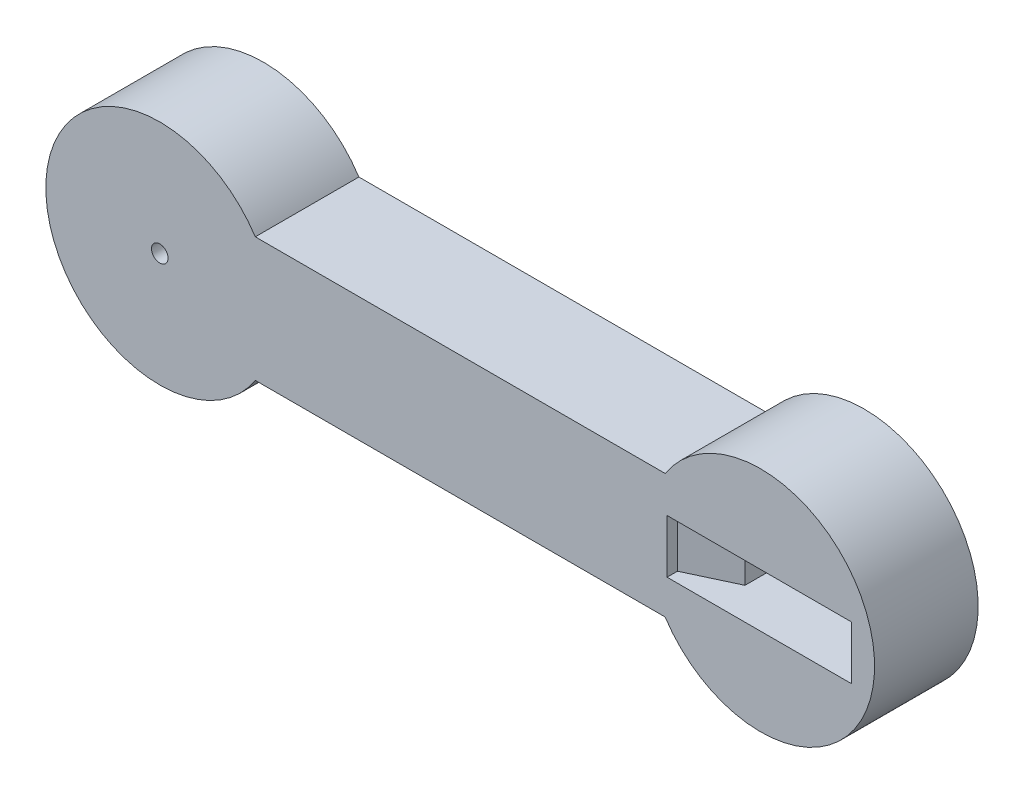
ISO-10303-21;
HEADER;
FILE_DESCRIPTION(('STEP AP214'),'2;1');
FILE_NAME('part.step','',(''),(''),'','','');
FILE_SCHEMA(('AUTOMOTIVE_DESIGN { 1 0 10303 214 1 1 1 1 }'));
ENDSEC;
DATA;
#1=APPLICATION_CONTEXT('core data for automotive mechanical design processes');
#2=APPLICATION_PROTOCOL_DEFINITION('international standard','automotive_design',2000,#1);
#3=PRODUCT_CONTEXT('',#1,'mechanical');
#4=PRODUCT('Part','Part','',(#3));
#5=PRODUCT_RELATED_PRODUCT_CATEGORY('part','',(#4));
#6=PRODUCT_DEFINITION_FORMATION('','',#4);
#7=PRODUCT_DEFINITION_CONTEXT('part definition',#1,'design');
#8=PRODUCT_DEFINITION('design','',#6,#7);
#9=PRODUCT_DEFINITION_SHAPE('','',#8);
#10=(LENGTH_UNIT() NAMED_UNIT(*) SI_UNIT(.MILLI.,.METRE.));
#11=(NAMED_UNIT(*) PLANE_ANGLE_UNIT() SI_UNIT($,.RADIAN.));
#12=(NAMED_UNIT(*) SI_UNIT($,.STERADIAN.) SOLID_ANGLE_UNIT());
#13=UNCERTAINTY_MEASURE_WITH_UNIT(LENGTH_MEASURE(1.E-05),#10,'distance_accuracy_value','');
#14=(GEOMETRIC_REPRESENTATION_CONTEXT(3) GLOBAL_UNCERTAINTY_ASSIGNED_CONTEXT((#13)) GLOBAL_UNIT_ASSIGNED_CONTEXT((#10,
#11,#12)) REPRESENTATION_CONTEXT('',''));
#15=CARTESIAN_POINT('',(0.,0.,0.));
#16=DIRECTION('',(0.,0.,1.));
#17=DIRECTION('',(1.,0.,0.));
#18=AXIS2_PLACEMENT_3D('',#15,#16,#17);
#19=CARTESIAN_POINT('',(0.,0.,25.));
#20=DIRECTION('',(0.,0.,1.));
#21=DIRECTION('',(1.,0.,0.));
#22=AXIS2_PLACEMENT_3D('',#19,#20,#21);
#23=PLANE('',#22);
#24=CARTESIAN_POINT('',(0.,0.,25.));
#25=DIRECTION('',(0.,0.,1.));
#26=DIRECTION('',(1.,0.,0.));
#27=AXIS2_PLACEMENT_3D('',#24,#25,#26);
#28=CIRCLE('',#27,2.);
#29=CARTESIAN_POINT('',(2.,0.,25.));
#30=VERTEX_POINT('',#29);
#31=EDGE_CURVE('E325',#30,#30,#28,.T.);
#32=ORIENTED_EDGE('',*,*,#31,.F.);
#33=EDGE_LOOP('',(#32));
#34=FACE_BOUND('',#33,.T.);
#35=DIRECTION('',(-1.,0.,0.));
#36=VECTOR('',#35,1.);
#37=CARTESIAN_POINT('',(0.,6.44999999999997,25.));
#38=LINE('',#37,#36);
#39=CARTESIAN_POINT('',(166.919342789878,6.44999999999997,25.));
#40=VERTEX_POINT('',#39);
#41=CARTESIAN_POINT('',(122.419342789878,6.45,25.));
#42=VERTEX_POINT('',#41);
#43=EDGE_CURVE('E183',#40,#42,#38,.T.);
#44=ORIENTED_EDGE('',*,*,#43,.F.);
#45=DIRECTION('',(0.,-1.,0.));
#46=VECTOR('',#45,1.);
#47=CARTESIAN_POINT('',(166.919342789878,6.44999999999997,25.));
#48=LINE('',#47,#46);
#49=CARTESIAN_POINT('',(166.919342789878,-6.45000000000002,25.));
#50=VERTEX_POINT('',#49);
#51=EDGE_CURVE('E190',#40,#50,#48,.T.);
#52=ORIENTED_EDGE('',*,*,#51,.T.);
#53=DIRECTION('',(1.,0.,0.));
#54=VECTOR('',#53,1.);
#55=CARTESIAN_POINT('',(0.,-6.45000000000003,25.));
#56=LINE('',#55,#54);
#57=CARTESIAN_POINT('',(122.419342789878,-6.45,25.));
#58=VERTEX_POINT('',#57);
#59=EDGE_CURVE('E169',#58,#50,#56,.T.);
#60=ORIENTED_EDGE('',*,*,#59,.F.);
#61=DIRECTION('',(0.,-1.,0.));
#62=VECTOR('',#61,1.);
#63=CARTESIAN_POINT('',(122.419342789878,6.45,25.));
#64=LINE('',#63,#62);
#65=EDGE_CURVE('E224',#42,#58,#64,.T.);
#66=ORIENTED_EDGE('',*,*,#65,.F.);
#67=EDGE_LOOP('',(#44,#52,#60,#66));
#68=FACE_BOUND('',#67,.T.);
#69=CARTESIAN_POINT('',(0.,0.,25.));
#70=DIRECTION('',(0.,0.,1.));
#71=DIRECTION('',(1.,0.,0.));
#72=AXIS2_PLACEMENT_3D('',#69,#70,#71);
#73=CIRCLE('',#72,27.5);
#74=CARTESIAN_POINT('',(23.0488611432322,15.,25.));
#75=VERTEX_POINT('',#74);
#76=CARTESIAN_POINT('',(23.0488611432322,-15.,25.));
#77=VERTEX_POINT('',#76);
#78=EDGE_CURVE('E280',#75,#77,#73,.T.);
#79=ORIENTED_EDGE('',*,*,#78,.T.);
#80=DIRECTION('',(1.,0.,0.));
#81=VECTOR('',#80,1.);
#82=CARTESIAN_POINT('',(0.,-15.,25.));
#83=LINE('',#82,#81);
#84=CARTESIAN_POINT('',(121.951138856768,-15.,25.));
#85=VERTEX_POINT('',#84);
#86=EDGE_CURVE('E283',#77,#85,#83,.T.);
#87=ORIENTED_EDGE('',*,*,#86,.T.);
#88=CARTESIAN_POINT('',(145.,0.,25.));
#89=DIRECTION('',(0.,0.,1.));
#90=DIRECTION('',(1.,0.,0.));
#91=AXIS2_PLACEMENT_3D('',#88,#89,#90);
#92=CIRCLE('',#91,27.5);
#93=CARTESIAN_POINT('',(121.951138856768,15.,25.));
#94=VERTEX_POINT('',#93);
#95=EDGE_CURVE('E286',#85,#94,#92,.T.);
#96=ORIENTED_EDGE('',*,*,#95,.T.);
#97=DIRECTION('',(1.,0.,0.));
#98=VECTOR('',#97,1.);
#99=CARTESIAN_POINT('',(0.,15.,25.));
#100=LINE('',#99,#98);
#101=EDGE_CURVE('E288',#75,#94,#100,.T.);
#102=ORIENTED_EDGE('',*,*,#101,.F.);
#103=EDGE_LOOP('',(#79,#87,#96,#102));
#104=FACE_BOUND('',#103,.T.);
#105=ADVANCED_FACE('F44',(#34,#68,#104),#23,.T.);
#106=CARTESIAN_POINT('',(0.,0.,4.5));
#107=DIRECTION('',(0.,0.,-1.));
#108=DIRECTION('',(-1.,0.,0.));
#109=AXIS2_PLACEMENT_3D('',#106,#107,#108);
#110=PLANE('',#109);
#111=CARTESIAN_POINT('',(136.75,0.,4.5));
#112=DIRECTION('',(0.,0.,-1.));
#113=DIRECTION('',(-1.,0.,0.));
#114=AXIS2_PLACEMENT_3D('',#111,#112,#113);
#115=CIRCLE('',#114,1.09999999999999);
#116=CARTESIAN_POINT('',(135.65,0.,4.5));
#117=VERTEX_POINT('',#116);
#118=EDGE_CURVE('E201',#117,#117,#115,.T.);
#119=ORIENTED_EDGE('',*,*,#118,.F.);
#120=EDGE_LOOP('',(#119));
#121=FACE_BOUND('',#120,.T.);
#122=DIRECTION('',(1.,0.,0.));
#123=VECTOR('',#122,1.);
#124=CARTESIAN_POINT('',(133.519342789878,6.44999999999997,4.5));
#125=LINE('',#124,#123);
#126=CARTESIAN_POINT('',(133.519342789878,6.44999999999997,4.5));
#127=VERTEX_POINT('',#126);
#128=CARTESIAN_POINT('',(138.419342789878,6.44999999999997,4.5));
#129=VERTEX_POINT('',#128);
#130=EDGE_CURVE('E251',#127,#129,#125,.T.);
#131=ORIENTED_EDGE('',*,*,#130,.T.);
#132=DIRECTION('',(0.,-1.,0.));
#133=VECTOR('',#132,1.);
#134=CARTESIAN_POINT('',(138.419342789878,0.,4.5));
#135=LINE('',#134,#133);
#136=CARTESIAN_POINT('',(138.419342789878,-6.45000000000003,4.5));
#137=VERTEX_POINT('',#136);
#138=EDGE_CURVE('E313',#129,#137,#135,.T.);
#139=ORIENTED_EDGE('',*,*,#138,.T.);
#140=DIRECTION('',(-1.,0.,0.));
#141=VECTOR('',#140,1.);
#142=CARTESIAN_POINT('',(133.519342789878,-6.45000000000003,4.5));
#143=LINE('',#142,#141);
#144=CARTESIAN_POINT('',(133.519342789878,-6.45000000000003,4.5));
#145=VERTEX_POINT('',#144);
#146=EDGE_CURVE('E257',#137,#145,#143,.T.);
#147=ORIENTED_EDGE('',*,*,#146,.T.);
#148=DIRECTION('',(0.,1.,0.));
#149=VECTOR('',#148,1.);
#150=CARTESIAN_POINT('',(133.519342789878,-6.45000000000003,4.5));
#151=LINE('',#150,#149);
#152=EDGE_CURVE('E246',#145,#127,#151,.T.);
#153=ORIENTED_EDGE('',*,*,#152,.T.);
#154=EDGE_LOOP('',(#131,#139,#147,#153));
#155=FACE_BOUND('',#154,.T.);
#156=ADVANCED_FACE('F337',(#121,#155),#110,.T.);
#157=CARTESIAN_POINT('',(0.,0.,25.));
#158=DIRECTION('',(0.,0.,-1.));
#159=DIRECTION('',(-1.,0.,0.));
#160=AXIS2_PLACEMENT_3D('',#157,#158,#159);
#161=CYLINDRICAL_SURFACE('',#160,27.5);
#162=CARTESIAN_POINT('',(0.,0.,0.));
#163=DIRECTION('',(0.,0.,1.));
#164=DIRECTION('',(1.,0.,0.));
#165=AXIS2_PLACEMENT_3D('',#162,#163,#164);
#166=CIRCLE('',#165,27.5);
#167=CARTESIAN_POINT('',(23.0488611432322,15.,0.));
#168=VERTEX_POINT('',#167);
#169=CARTESIAN_POINT('',(23.0488611432322,-15.,0.));
#170=VERTEX_POINT('',#169);
#171=EDGE_CURVE('E272',#168,#170,#166,.T.);
#172=ORIENTED_EDGE('',*,*,#171,.T.);
#173=DIRECTION('',(0.,0.,-1.));
#174=VECTOR('',#173,1.);
#175=CARTESIAN_POINT('',(23.0488611432322,-15.,25.));
#176=LINE('',#175,#174);
#177=EDGE_CURVE('E307',#77,#170,#176,.T.);
#178=ORIENTED_EDGE('',*,*,#177,.F.);
#179=ORIENTED_EDGE('',*,*,#78,.F.);
#180=DIRECTION('',(0.,0.,-1.));
#181=VECTOR('',#180,1.);
#182=CARTESIAN_POINT('',(23.0488611432322,15.,25.));
#183=LINE('',#182,#181);
#184=EDGE_CURVE('E291',#75,#168,#183,.T.);
#185=ORIENTED_EDGE('',*,*,#184,.T.);
#186=EDGE_LOOP('',(#172,#178,#179,#185));
#187=FACE_BOUND('',#186,.T.);
#188=ADVANCED_FACE('F46',(#187),#161,.T.);
#189=CARTESIAN_POINT('',(0.,-15.,25.));
#190=DIRECTION('',(0.,1.,0.));
#191=DIRECTION('',(-1.,0.,0.));
#192=AXIS2_PLACEMENT_3D('',#189,#190,#191);
#193=PLANE('',#192);
#194=DIRECTION('',(1.,0.,0.));
#195=VECTOR('',#194,1.);
#196=CARTESIAN_POINT('',(0.,-15.,0.));
#197=LINE('',#196,#195);
#198=CARTESIAN_POINT('',(121.951138856768,-15.,0.));
#199=VERTEX_POINT('',#198);
#200=EDGE_CURVE('E294',#170,#199,#197,.T.);
#201=ORIENTED_EDGE('',*,*,#200,.T.);
#202=DIRECTION('',(0.,0.,-1.));
#203=VECTOR('',#202,1.);
#204=CARTESIAN_POINT('',(121.951138856768,-15.,25.));
#205=LINE('',#204,#203);
#206=EDGE_CURVE('E304',#85,#199,#205,.T.);
#207=ORIENTED_EDGE('',*,*,#206,.F.);
#208=ORIENTED_EDGE('',*,*,#86,.F.);
#209=ORIENTED_EDGE('',*,*,#177,.T.);
#210=EDGE_LOOP('',(#201,#207,#208,#209));
#211=FACE_BOUND('',#210,.T.);
#212=ADVANCED_FACE('F361',(#211),#193,.F.);
#213=CARTESIAN_POINT('',(145.,0.,25.));
#214=DIRECTION('',(0.,0.,-1.));
#215=DIRECTION('',(-1.,0.,0.));
#216=AXIS2_PLACEMENT_3D('',#213,#214,#215);
#217=CYLINDRICAL_SURFACE('',#216,27.5);
#218=CARTESIAN_POINT('',(145.,0.,0.));
#219=DIRECTION('',(0.,0.,1.));
#220=DIRECTION('',(1.,0.,0.));
#221=AXIS2_PLACEMENT_3D('',#218,#219,#220);
#222=CIRCLE('',#221,27.5);
#223=CARTESIAN_POINT('',(121.951138856768,15.,0.));
#224=VERTEX_POINT('',#223);
#225=EDGE_CURVE('E296',#199,#224,#222,.T.);
#226=ORIENTED_EDGE('',*,*,#225,.T.);
#227=DIRECTION('',(0.,0.,-1.));
#228=VECTOR('',#227,1.);
#229=CARTESIAN_POINT('',(121.951138856768,15.,25.));
#230=LINE('',#229,#228);
#231=EDGE_CURVE('E302',#94,#224,#230,.T.);
#232=ORIENTED_EDGE('',*,*,#231,.F.);
#233=ORIENTED_EDGE('',*,*,#95,.F.);
#234=ORIENTED_EDGE('',*,*,#206,.T.);
#235=EDGE_LOOP('',(#226,#232,#233,#234));
#236=FACE_BOUND('',#235,.T.);
#237=ADVANCED_FACE('F358',(#236),#217,.T.);
#238=CARTESIAN_POINT('',(0.,15.,25.));
#239=DIRECTION('',(0.,1.,0.));
#240=DIRECTION('',(-1.,0.,0.));
#241=AXIS2_PLACEMENT_3D('',#238,#239,#240);
#242=PLANE('',#241);
#243=DIRECTION('',(1.,0.,0.));
#244=VECTOR('',#243,1.);
#245=CARTESIAN_POINT('',(0.,15.,0.));
#246=LINE('',#245,#244);
#247=EDGE_CURVE('E284',#168,#224,#246,.T.);
#248=ORIENTED_EDGE('',*,*,#247,.F.);
#249=ORIENTED_EDGE('',*,*,#184,.F.);
#250=ORIENTED_EDGE('',*,*,#101,.T.);
#251=ORIENTED_EDGE('',*,*,#231,.T.);
#252=EDGE_LOOP('',(#248,#249,#250,#251));
#253=FACE_BOUND('',#252,.T.);
#254=ADVANCED_FACE('F354',(#253),#242,.T.);
#255=CARTESIAN_POINT('',(0.,0.,0.));
#256=DIRECTION('',(0.,0.,1.));
#257=DIRECTION('',(1.,0.,0.));
#258=AXIS2_PLACEMENT_3D('',#255,#256,#257);
#259=PLANE('',#258);
#260=CARTESIAN_POINT('',(0.,0.,0.));
#261=DIRECTION('',(0.,0.,-1.));
#262=DIRECTION('',(-1.,0.,0.));
#263=AXIS2_PLACEMENT_3D('',#260,#261,#262);
#264=CIRCLE('',#263,20.0000000000004);
#265=CARTESIAN_POINT('',(-20.0000000000004,0.,0.));
#266=VERTEX_POINT('',#265);
#267=EDGE_CURVE('E234',#266,#266,#264,.T.);
#268=ORIENTED_EDGE('',*,*,#267,.F.);
#269=EDGE_LOOP('',(#268));
#270=FACE_BOUND('',#269,.T.);
#271=DIRECTION('',(1.,0.,0.));
#272=VECTOR('',#271,1.);
#273=CARTESIAN_POINT('',(133.519342789878,6.44999999999997,0.));
#274=LINE('',#273,#272);
#275=CARTESIAN_POINT('',(133.519342789878,6.44999999999997,0.));
#276=VERTEX_POINT('',#275);
#277=CARTESIAN_POINT('',(166.919342789878,6.44999999999998,0.));
#278=VERTEX_POINT('',#277);
#279=EDGE_CURVE('E263',#276,#278,#274,.T.);
#280=ORIENTED_EDGE('',*,*,#279,.F.);
#281=DIRECTION('',(0.,1.,0.));
#282=VECTOR('',#281,1.);
#283=CARTESIAN_POINT('',(133.519342789878,-6.45000000000003,0.));
#284=LINE('',#283,#282);
#285=CARTESIAN_POINT('',(133.519342789878,-6.45000000000003,0.));
#286=VERTEX_POINT('',#285);
#287=EDGE_CURVE('E243',#286,#276,#284,.T.);
#288=ORIENTED_EDGE('',*,*,#287,.F.);
#289=DIRECTION('',(-1.,0.,0.));
#290=VECTOR('',#289,1.);
#291=CARTESIAN_POINT('',(133.519342789878,-6.45000000000003,0.));
#292=LINE('',#291,#290);
#293=CARTESIAN_POINT('',(166.919342789878,-6.45000000000002,0.));
#294=VERTEX_POINT('',#293);
#295=EDGE_CURVE('E250',#294,#286,#292,.T.);
#296=ORIENTED_EDGE('',*,*,#295,.F.);
#297=DIRECTION('',(0.,-1.,0.));
#298=VECTOR('',#297,1.);
#299=CARTESIAN_POINT('',(166.919342789878,-6.45000000000002,0.));
#300=LINE('',#299,#298);
#301=EDGE_CURVE('E265',#278,#294,#300,.T.);
#302=ORIENTED_EDGE('',*,*,#301,.F.);
#303=EDGE_LOOP('',(#280,#288,#296,#302));
#304=FACE_BOUND('',#303,.T.);
#305=ORIENTED_EDGE('',*,*,#171,.F.);
#306=ORIENTED_EDGE('',*,*,#247,.T.);
#307=ORIENTED_EDGE('',*,*,#225,.F.);
#308=ORIENTED_EDGE('',*,*,#200,.F.);
#309=EDGE_LOOP('',(#305,#306,#307,#308));
#310=FACE_BOUND('',#309,.T.);
#311=ADVANCED_FACE('F351',(#270,#304,#310),#259,.F.);
#312=CARTESIAN_POINT('',(133.519342789878,-6.45000000000003,4.5));
#313=DIRECTION('',(-1.,0.,0.));
#314=DIRECTION('',(0.,0.,1.));
#315=AXIS2_PLACEMENT_3D('',#312,#313,#314);
#316=PLANE('',#315);
#317=ORIENTED_EDGE('',*,*,#287,.T.);
#318=DIRECTION('',(0.,0.,-1.));
#319=VECTOR('',#318,1.);
#320=CARTESIAN_POINT('',(133.519342789878,6.44999999999997,4.5));
#321=LINE('',#320,#319);
#322=EDGE_CURVE('E261',#127,#276,#321,.T.);
#323=ORIENTED_EDGE('',*,*,#322,.F.);
#324=ORIENTED_EDGE('',*,*,#152,.F.);
#325=DIRECTION('',(0.,0.,-1.));
#326=VECTOR('',#325,1.);
#327=CARTESIAN_POINT('',(133.519342789878,-6.45000000000003,4.5));
#328=LINE('',#327,#326);
#329=EDGE_CURVE('E269',#145,#286,#328,.T.);
#330=ORIENTED_EDGE('',*,*,#329,.T.);
#331=EDGE_LOOP('',(#317,#323,#324,#330));
#332=FACE_BOUND('',#331,.T.);
#333=ADVANCED_FACE('F349',(#332),#316,.F.);
#334=CARTESIAN_POINT('',(133.519342789878,-6.45000000000003,4.5));
#335=DIRECTION('',(0.,-1.,0.));
#336=DIRECTION('',(1.,0.,0.));
#337=AXIS2_PLACEMENT_3D('',#334,#335,#336);
#338=PLANE('',#337);
#339=DIRECTION('',(0.,0.,-1.));
#340=VECTOR('',#339,1.);
#341=CARTESIAN_POINT('',(138.419342789878,-6.45000000000003,25.));
#342=LINE('',#341,#340);
#343=CARTESIAN_POINT('',(138.419342789878,-6.45000000000002,6.5));
#344=VERTEX_POINT('',#343);
#345=EDGE_CURVE('E232',#344,#137,#342,.T.);
#346=ORIENTED_EDGE('',*,*,#345,.F.);
#347=DIRECTION('',(-1.,0.,0.));
#348=VECTOR('',#347,1.);
#349=CARTESIAN_POINT('',(166.919342789878,-6.45000000000002,6.5));
#350=LINE('',#349,#348);
#351=CARTESIAN_POINT('',(133.519342789878,-6.45000000000002,6.5));
#352=VERTEX_POINT('',#351);
#353=EDGE_CURVE('E204',#344,#352,#350,.T.);
#354=ORIENTED_EDGE('',*,*,#353,.T.);
#355=DIRECTION('',(0.,0.,-1.));
#356=VECTOR('',#355,1.);
#357=CARTESIAN_POINT('',(133.519342789878,-6.45000000000002,25.));
#358=LINE('',#357,#356);
#359=CARTESIAN_POINT('',(133.519342789878,-6.45,17.296875));
#360=VERTEX_POINT('',#359);
#361=EDGE_CURVE('E68',#360,#352,#358,.T.);
#362=ORIENTED_EDGE('',*,*,#361,.F.);
#363=DIRECTION('',(0.905458935958869,0.,-0.42443387623072));
#364=VECTOR('',#363,1.);
#365=CARTESIAN_POINT('',(30.7000417355666,-6.45,65.4934223692087));
#366=LINE('',#365,#364);
#367=CARTESIAN_POINT('',(122.419342789878,-6.45,22.5));
#368=VERTEX_POINT('',#367);
#369=EDGE_CURVE('E221',#368,#360,#366,.T.);
#370=ORIENTED_EDGE('',*,*,#369,.F.);
#371=DIRECTION('',(0.,0.,-1.));
#372=VECTOR('',#371,1.);
#373=CARTESIAN_POINT('',(122.419342789878,-6.45,0.));
#374=LINE('',#373,#372);
#375=EDGE_CURVE('E177',#58,#368,#374,.T.);
#376=ORIENTED_EDGE('',*,*,#375,.F.);
#377=ORIENTED_EDGE('',*,*,#59,.T.);
#378=DIRECTION('',(0.,0.,-1.));
#379=VECTOR('',#378,1.);
#380=CARTESIAN_POINT('',(166.919342789878,-6.45000000000002,25.));
#381=LINE('',#380,#379);
#382=CARTESIAN_POINT('',(166.919342789878,-6.45000000000002,6.5));
#383=VERTEX_POINT('',#382);
#384=EDGE_CURVE('E174',#50,#383,#381,.T.);
#385=ORIENTED_EDGE('',*,*,#384,.T.);
#386=CARTESIAN_POINT('',(162.019342789878,-6.45000000000002,6.5));
#387=VERTEX_POINT('',#386);
#388=EDGE_CURVE('E205',#383,#387,#350,.T.);
#389=ORIENTED_EDGE('',*,*,#388,.T.);
#390=DIRECTION('',(0.,0.,-1.));
#391=VECTOR('',#390,1.);
#392=CARTESIAN_POINT('',(162.019342789878,-6.45000000000002,25.));
#393=LINE('',#392,#391);
#394=CARTESIAN_POINT('',(162.019342789878,-6.45000000000002,4.5));
#395=VERTEX_POINT('',#394);
#396=EDGE_CURVE('E235',#387,#395,#393,.T.);
#397=ORIENTED_EDGE('',*,*,#396,.T.);
#398=CARTESIAN_POINT('',(166.919342789878,-6.45000000000002,4.5));
#399=VERTEX_POINT('',#398);
#400=EDGE_CURVE('E258',#399,#395,#143,.T.);
#401=ORIENTED_EDGE('',*,*,#400,.F.);
#402=DIRECTION('',(0.,0.,-1.));
#403=VECTOR('',#402,1.);
#404=CARTESIAN_POINT('',(166.919342789878,-6.45000000000002,4.5));
#405=LINE('',#404,#403);
#406=EDGE_CURVE('E273',#399,#294,#405,.T.);
#407=ORIENTED_EDGE('',*,*,#406,.T.);
#408=ORIENTED_EDGE('',*,*,#295,.T.);
#409=ORIENTED_EDGE('',*,*,#329,.F.);
#410=ORIENTED_EDGE('',*,*,#146,.F.);
#411=EDGE_LOOP('',(#346,#354,#362,#370,#376,#377,#385,#389,#397,#401,#407,#408,#409,#410));
#412=FACE_BOUND('',#411,.T.);
#413=ADVANCED_FACE('F172',(#412),#338,.F.);
#414=CARTESIAN_POINT('',(166.919342789878,-6.45000000000002,4.5));
#415=DIRECTION('',(1.,0.,0.));
#416=DIRECTION('',(0.,0.,-1.));
#417=AXIS2_PLACEMENT_3D('',#414,#415,#416);
#418=PLANE('',#417);
#419=ORIENTED_EDGE('',*,*,#301,.T.);
#420=ORIENTED_EDGE('',*,*,#406,.F.);
#421=DIRECTION('',(0.,-1.,0.));
#422=VECTOR('',#421,1.);
#423=CARTESIAN_POINT('',(166.919342789878,-6.45000000000002,4.5));
#424=LINE('',#423,#422);
#425=CARTESIAN_POINT('',(166.919342789878,6.44999999999998,4.5));
#426=VERTEX_POINT('',#425);
#427=EDGE_CURVE('E254',#426,#399,#424,.T.);
#428=ORIENTED_EDGE('',*,*,#427,.F.);
#429=DIRECTION('',(0.,0.,-1.));
#430=VECTOR('',#429,1.);
#431=CARTESIAN_POINT('',(166.919342789878,6.44999999999998,4.5));
#432=LINE('',#431,#430);
#433=EDGE_CURVE('E275',#426,#278,#432,.T.);
#434=ORIENTED_EDGE('',*,*,#433,.T.);
#435=EDGE_LOOP('',(#419,#420,#428,#434));
#436=FACE_BOUND('',#435,.T.);
#437=ADVANCED_FACE('F431',(#436),#418,.F.);
#438=CARTESIAN_POINT('',(133.519342789878,6.44999999999997,4.5));
#439=DIRECTION('',(0.,1.,0.));
#440=DIRECTION('',(-1.,0.,0.));
#441=AXIS2_PLACEMENT_3D('',#438,#439,#440);
#442=PLANE('',#441);
#443=DIRECTION('',(0.,0.,-1.));
#444=VECTOR('',#443,1.);
#445=CARTESIAN_POINT('',(162.019342789878,6.44999999999998,25.));
#446=LINE('',#445,#444);
#447=CARTESIAN_POINT('',(162.019342789878,6.44999999999998,6.5));
#448=VERTEX_POINT('',#447);
#449=CARTESIAN_POINT('',(162.019342789878,6.44999999999998,4.5));
#450=VERTEX_POINT('',#449);
#451=EDGE_CURVE('E237',#448,#450,#446,.T.);
#452=ORIENTED_EDGE('',*,*,#451,.F.);
#453=DIRECTION('',(1.,0.,0.));
#454=VECTOR('',#453,1.);
#455=CARTESIAN_POINT('',(166.919342789878,6.44999999999997,6.5));
#456=LINE('',#455,#454);
#457=CARTESIAN_POINT('',(166.919342789878,6.44999999999997,6.5));
#458=VERTEX_POINT('',#457);
#459=EDGE_CURVE('E61',#448,#458,#456,.T.);
#460=ORIENTED_EDGE('',*,*,#459,.T.);
#461=DIRECTION('',(0.,0.,-1.));
#462=VECTOR('',#461,1.);
#463=CARTESIAN_POINT('',(166.919342789878,6.44999999999997,25.));
#464=LINE('',#463,#462);
#465=EDGE_CURVE('E210',#40,#458,#464,.T.);
#466=ORIENTED_EDGE('',*,*,#465,.F.);
#467=ORIENTED_EDGE('',*,*,#43,.T.);
#468=DIRECTION('',(0.,0.,-1.));
#469=VECTOR('',#468,1.);
#470=CARTESIAN_POINT('',(122.419342789878,6.45,0.));
#471=LINE('',#470,#469);
#472=CARTESIAN_POINT('',(122.419342789878,6.45,22.5));
#473=VERTEX_POINT('',#472);
#474=EDGE_CURVE('E217',#42,#473,#471,.T.);
#475=ORIENTED_EDGE('',*,*,#474,.T.);
#476=DIRECTION('',(0.905458935958869,0.,-0.42443387623072));
#477=VECTOR('',#476,1.);
#478=CARTESIAN_POINT('',(30.7000417355666,6.45,65.4934223692087));
#479=LINE('',#478,#477);
#480=CARTESIAN_POINT('',(133.519342789878,6.44999999999997,17.296875));
#481=VERTEX_POINT('',#480);
#482=EDGE_CURVE('E220',#473,#481,#479,.T.);
#483=ORIENTED_EDGE('',*,*,#482,.T.);
#484=DIRECTION('',(0.,0.,-1.));
#485=VECTOR('',#484,1.);
#486=CARTESIAN_POINT('',(133.519342789878,6.44999999999997,25.));
#487=LINE('',#486,#485);
#488=CARTESIAN_POINT('',(133.519342789878,6.44999999999997,6.5));
#489=VERTEX_POINT('',#488);
#490=EDGE_CURVE('E213',#481,#489,#487,.T.);
#491=ORIENTED_EDGE('',*,*,#490,.T.);
#492=CARTESIAN_POINT('',(138.419342789878,6.44999999999997,6.5));
#493=VERTEX_POINT('',#492);
#494=EDGE_CURVE('E195',#489,#493,#456,.T.);
#495=ORIENTED_EDGE('',*,*,#494,.T.);
#496=DIRECTION('',(0.,0.,-1.));
#497=VECTOR('',#496,1.);
#498=CARTESIAN_POINT('',(138.419342789878,6.44999999999997,25.));
#499=LINE('',#498,#497);
#500=EDGE_CURVE('E182',#493,#129,#499,.T.);
#501=ORIENTED_EDGE('',*,*,#500,.T.);
#502=ORIENTED_EDGE('',*,*,#130,.F.);
#503=ORIENTED_EDGE('',*,*,#322,.T.);
#504=ORIENTED_EDGE('',*,*,#279,.T.);
#505=ORIENTED_EDGE('',*,*,#433,.F.);
#506=EDGE_CURVE('E249',#450,#426,#125,.T.);
#507=ORIENTED_EDGE('',*,*,#506,.F.);
#508=EDGE_LOOP('',(#452,#460,#466,#467,#475,#483,#491,#495,#501,#502,#503,#504,#505,#507));
#509=FACE_BOUND('',#508,.T.);
#510=ADVANCED_FACE('F442',(#509),#442,.F.);
#511=CARTESIAN_POINT('',(163.75,0.,4.5));
#512=DIRECTION('',(0.,0.,-1.));
#513=DIRECTION('',(-1.,0.,0.));
#514=AXIS2_PLACEMENT_3D('',#511,#512,#513);
#515=CIRCLE('',#514,1.09999999999999);
#516=CARTESIAN_POINT('',(162.65,0.,4.5));
#517=VERTEX_POINT('',#516);
#518=EDGE_CURVE('E319',#517,#517,#515,.T.);
#519=ORIENTED_EDGE('',*,*,#518,.F.);
#520=EDGE_LOOP('',(#519));
#521=FACE_BOUND('',#520,.T.);
#522=DIRECTION('',(0.,-1.,0.));
#523=VECTOR('',#522,1.);
#524=CARTESIAN_POINT('',(162.019342789878,0.,4.5));
#525=LINE('',#524,#523);
#526=EDGE_CURVE('E310',#450,#395,#525,.T.);
#527=ORIENTED_EDGE('',*,*,#526,.F.);
#528=ORIENTED_EDGE('',*,*,#506,.T.);
#529=ORIENTED_EDGE('',*,*,#427,.T.);
#530=ORIENTED_EDGE('',*,*,#400,.T.);
#531=EDGE_LOOP('',(#527,#528,#529,#530));
#532=FACE_BOUND('',#531,.T.);
#533=ADVANCED_FACE('F346',(#521,#532),#110,.T.);
#534=CARTESIAN_POINT('',(0.,0.,5.));
#535=DIRECTION('',(0.,0.,-1.));
#536=DIRECTION('',(-1.,0.,0.));
#537=AXIS2_PLACEMENT_3D('',#534,#535,#536);
#538=CYLINDRICAL_SURFACE('',#537,20.0000000000004);
#539=CARTESIAN_POINT('',(0.,0.,5.));
#540=DIRECTION('',(0.,0.,-1.));
#541=DIRECTION('',(-1.,0.,0.));
#542=AXIS2_PLACEMENT_3D('',#539,#540,#541);
#543=CIRCLE('',#542,20.0000000000004);
#544=CARTESIAN_POINT('',(-20.0000000000004,0.,5.));
#545=VERTEX_POINT('',#544);
#546=EDGE_CURVE('E240',#545,#545,#543,.T.);
#547=ORIENTED_EDGE('',*,*,#546,.F.);
#548=EDGE_LOOP('',(#547));
#549=FACE_BOUND('',#548,.T.);
#550=ORIENTED_EDGE('',*,*,#267,.T.);
#551=EDGE_LOOP('',(#550));
#552=FACE_BOUND('',#551,.T.);
#553=ADVANCED_FACE('F464',(#549,#552),#538,.F.);
#554=CARTESIAN_POINT('',(0.,0.,5.));
#555=DIRECTION('',(0.,0.,-1.));
#556=DIRECTION('',(-1.,0.,0.));
#557=AXIS2_PLACEMENT_3D('',#554,#555,#556);
#558=PLANE('',#557);
#559=CARTESIAN_POINT('',(0.,0.,5.));
#560=DIRECTION('',(0.,0.,-1.));
#561=DIRECTION('',(-1.,0.,0.));
#562=AXIS2_PLACEMENT_3D('',#559,#560,#561);
#563=CIRCLE('',#562,2.);
#564=CARTESIAN_POINT('',(2.,0.,5.));
#565=VERTEX_POINT('',#564);
#566=EDGE_CURVE('E320',#565,#565,#563,.F.);
#567=ORIENTED_EDGE('',*,*,#566,.T.);
#568=EDGE_LOOP('',(#567));
#569=FACE_BOUND('',#568,.T.);
#570=ORIENTED_EDGE('',*,*,#546,.T.);
#571=EDGE_LOOP('',(#570));
#572=FACE_BOUND('',#571,.T.);
#573=ADVANCED_FACE('F473',(#569,#572),#558,.T.);
#574=CARTESIAN_POINT('',(138.419342789878,0.,25.));
#575=DIRECTION('',(1.,0.,0.));
#576=DIRECTION('',(0.,0.,-1.));
#577=AXIS2_PLACEMENT_3D('',#574,#575,#576);
#578=PLANE('',#577);
#579=DIRECTION('',(0.,1.,0.));
#580=VECTOR('',#579,1.);
#581=CARTESIAN_POINT('',(138.419342789878,0.,6.5));
#582=LINE('',#581,#580);
#583=EDGE_CURVE('E212',#344,#493,#582,.T.);
#584=ORIENTED_EDGE('',*,*,#583,.F.);
#585=ORIENTED_EDGE('',*,*,#345,.T.);
#586=ORIENTED_EDGE('',*,*,#138,.F.);
#587=ORIENTED_EDGE('',*,*,#500,.F.);
#588=EDGE_LOOP('',(#584,#585,#586,#587));
#589=FACE_BOUND('',#588,.T.);
#590=ADVANCED_FACE('F481',(#589),#578,.T.);
#591=CARTESIAN_POINT('',(162.019342789878,0.,25.));
#592=DIRECTION('',(1.,0.,0.));
#593=DIRECTION('',(0.,0.,-1.));
#594=AXIS2_PLACEMENT_3D('',#591,#592,#593);
#595=PLANE('',#594);
#596=ORIENTED_EDGE('',*,*,#396,.F.);
#597=DIRECTION('',(0.,1.,0.));
#598=VECTOR('',#597,1.);
#599=CARTESIAN_POINT('',(162.019342789878,0.,6.5));
#600=LINE('',#599,#598);
#601=EDGE_CURVE('E12',#387,#448,#600,.T.);
#602=ORIENTED_EDGE('',*,*,#601,.T.);
#603=ORIENTED_EDGE('',*,*,#451,.T.);
#604=ORIENTED_EDGE('',*,*,#526,.T.);
#605=EDGE_LOOP('',(#596,#602,#603,#604));
#606=FACE_BOUND('',#605,.T.);
#607=ADVANCED_FACE('F521',(#606),#595,.F.);
#608=CARTESIAN_POINT('',(30.7000417355666,6.45,65.4934223692087));
#609=DIRECTION('',(-0.42443387623072,0.,-0.905458935958868));
#610=DIRECTION('',(-0.905458935958869,0.,0.42443387623072));
#611=AXIS2_PLACEMENT_3D('',#608,#609,#610);
#612=PLANE('',#611);
#613=ORIENTED_EDGE('',*,*,#369,.T.);
#614=DIRECTION('',(0.,1.,0.));
#615=VECTOR('',#614,1.);
#616=CARTESIAN_POINT('',(133.519342789878,6.45,17.296875));
#617=LINE('',#616,#615);
#618=EDGE_CURVE('E53',#360,#481,#617,.T.);
#619=ORIENTED_EDGE('',*,*,#618,.T.);
#620=ORIENTED_EDGE('',*,*,#482,.F.);
#621=DIRECTION('',(0.,-1.,0.));
#622=VECTOR('',#621,1.);
#623=CARTESIAN_POINT('',(122.419342789878,6.45,22.5));
#624=LINE('',#623,#622);
#625=EDGE_CURVE('E228',#473,#368,#624,.T.);
#626=ORIENTED_EDGE('',*,*,#625,.T.);
#627=EDGE_LOOP('',(#613,#619,#620,#626));
#628=FACE_BOUND('',#627,.T.);
#629=ADVANCED_FACE('F517',(#628),#612,.F.);
#630=CARTESIAN_POINT('',(122.419342789878,6.45,0.));
#631=DIRECTION('',(-1.,0.,0.));
#632=DIRECTION('',(0.,0.,1.));
#633=AXIS2_PLACEMENT_3D('',#630,#631,#632);
#634=PLANE('',#633);
#635=ORIENTED_EDGE('',*,*,#375,.T.);
#636=ORIENTED_EDGE('',*,*,#625,.F.);
#637=ORIENTED_EDGE('',*,*,#474,.F.);
#638=ORIENTED_EDGE('',*,*,#65,.T.);
#639=EDGE_LOOP('',(#635,#636,#637,#638));
#640=FACE_BOUND('',#639,.T.);
#641=ADVANCED_FACE('F509',(#640),#634,.F.);
#642=CARTESIAN_POINT('',(133.519342789878,6.44999999999997,25.));
#643=DIRECTION('',(-1.,0.,0.));
#644=DIRECTION('',(0.,0.,1.));
#645=AXIS2_PLACEMENT_3D('',#642,#643,#644);
#646=PLANE('',#645);
#647=ORIENTED_EDGE('',*,*,#361,.T.);
#648=DIRECTION('',(0.,1.,0.));
#649=VECTOR('',#648,1.);
#650=CARTESIAN_POINT('',(133.519342789878,6.44999999999997,6.5));
#651=LINE('',#650,#649);
#652=EDGE_CURVE('E207',#352,#489,#651,.T.);
#653=ORIENTED_EDGE('',*,*,#652,.T.);
#654=ORIENTED_EDGE('',*,*,#490,.F.);
#655=ORIENTED_EDGE('',*,*,#618,.F.);
#656=EDGE_LOOP('',(#647,#653,#654,#655));
#657=FACE_BOUND('',#656,.T.);
#658=ADVANCED_FACE('F504',(#657),#646,.F.);
#659=CARTESIAN_POINT('',(0.,0.,6.5));
#660=DIRECTION('',(0.,0.,-1.));
#661=DIRECTION('',(-1.,0.,0.));
#662=AXIS2_PLACEMENT_3D('',#659,#660,#661);
#663=PLANE('',#662);
#664=CARTESIAN_POINT('',(136.75,0.,6.5));
#665=DIRECTION('',(0.,0.,-1.));
#666=DIRECTION('',(-1.,0.,0.));
#667=AXIS2_PLACEMENT_3D('',#664,#665,#666);
#668=CIRCLE('',#667,1.09999999999999);
#669=CARTESIAN_POINT('',(135.65,0.,6.5));
#670=VERTEX_POINT('',#669);
#671=EDGE_CURVE('E48',#670,#670,#668,.T.);
#672=ORIENTED_EDGE('',*,*,#671,.T.);
#673=EDGE_LOOP('',(#672));
#674=FACE_BOUND('',#673,.T.);
#675=ORIENTED_EDGE('',*,*,#583,.T.);
#676=ORIENTED_EDGE('',*,*,#494,.F.);
#677=ORIENTED_EDGE('',*,*,#652,.F.);
#678=ORIENTED_EDGE('',*,*,#353,.F.);
#679=EDGE_LOOP('',(#675,#676,#677,#678));
#680=FACE_BOUND('',#679,.T.);
#681=ADVANCED_FACE('F508',(#674,#680),#663,.F.);
#682=CARTESIAN_POINT('',(163.75,0.,6.5));
#683=DIRECTION('',(0.,0.,-1.));
#684=DIRECTION('',(-1.,0.,0.));
#685=AXIS2_PLACEMENT_3D('',#682,#683,#684);
#686=CIRCLE('',#685,1.09999999999999);
#687=CARTESIAN_POINT('',(162.65,0.,6.5));
#688=VERTEX_POINT('',#687);
#689=EDGE_CURVE('E317',#688,#688,#686,.T.);
#690=ORIENTED_EDGE('',*,*,#689,.T.);
#691=EDGE_LOOP('',(#690));
#692=FACE_BOUND('',#691,.T.);
#693=ORIENTED_EDGE('',*,*,#388,.F.);
#694=DIRECTION('',(0.,-1.,0.));
#695=VECTOR('',#694,1.);
#696=CARTESIAN_POINT('',(166.919342789878,6.44999999999997,6.5));
#697=LINE('',#696,#695);
#698=EDGE_CURVE('E191',#458,#383,#697,.T.);
#699=ORIENTED_EDGE('',*,*,#698,.F.);
#700=ORIENTED_EDGE('',*,*,#459,.F.);
#701=ORIENTED_EDGE('',*,*,#601,.F.);
#702=EDGE_LOOP('',(#693,#699,#700,#701));
#703=FACE_BOUND('',#702,.T.);
#704=ADVANCED_FACE('F497',(#692,#703),#663,.F.);
#705=CARTESIAN_POINT('',(166.919342789878,6.44999999999997,25.));
#706=DIRECTION('',(1.,0.,0.));
#707=DIRECTION('',(0.,0.,-1.));
#708=AXIS2_PLACEMENT_3D('',#705,#706,#707);
#709=PLANE('',#708);
#710=ORIENTED_EDGE('',*,*,#698,.T.);
#711=ORIENTED_EDGE('',*,*,#384,.F.);
#712=ORIENTED_EDGE('',*,*,#51,.F.);
#713=ORIENTED_EDGE('',*,*,#465,.T.);
#714=EDGE_LOOP('',(#710,#711,#712,#713));
#715=FACE_BOUND('',#714,.T.);
#716=ADVANCED_FACE('F188',(#715),#709,.F.);
#717=CARTESIAN_POINT('',(163.75,0.,25.));
#718=DIRECTION('',(0.,0.,-1.));
#719=DIRECTION('',(-1.,0.,0.));
#720=AXIS2_PLACEMENT_3D('',#717,#718,#719);
#721=CYLINDRICAL_SURFACE('',#720,1.09999999999999);
#722=ORIENTED_EDGE('',*,*,#518,.T.);
#723=EDGE_LOOP('',(#722));
#724=FACE_BOUND('',#723,.T.);
#725=ORIENTED_EDGE('',*,*,#689,.F.);
#726=EDGE_LOOP('',(#725));
#727=FACE_BOUND('',#726,.T.);
#728=ADVANCED_FACE('F496',(#724,#727),#721,.F.);
#729=CARTESIAN_POINT('',(136.75,0.,25.));
#730=DIRECTION('',(0.,0.,-1.));
#731=DIRECTION('',(-1.,0.,0.));
#732=AXIS2_PLACEMENT_3D('',#729,#730,#731);
#733=CYLINDRICAL_SURFACE('',#732,1.09999999999999);
#734=ORIENTED_EDGE('',*,*,#118,.T.);
#735=EDGE_LOOP('',(#734));
#736=FACE_BOUND('',#735,.T.);
#737=ORIENTED_EDGE('',*,*,#671,.F.);
#738=EDGE_LOOP('',(#737));
#739=FACE_BOUND('',#738,.T.);
#740=ADVANCED_FACE('F579',(#736,#739),#733,.F.);
#741=CARTESIAN_POINT('',(0.,0.,-0.65685424949238));
#742=DIRECTION('',(0.,0.,1.));
#743=DIRECTION('',(1.,0.,0.));
#744=AXIS2_PLACEMENT_3D('',#741,#742,#743);
#745=CYLINDRICAL_SURFACE('',#744,2.);
#746=CARTESIAN_POINT('',(2.,0.,25.));
#747=CARTESIAN_POINT('',(2.,0.,24.7916666666667));
#748=CARTESIAN_POINT('',(2.,0.,24.5833333333333));
#749=CARTESIAN_POINT('',(2.,0.,24.1666666666667));
#750=CARTESIAN_POINT('',(2.,0.,23.9583333333333));
#751=CARTESIAN_POINT('',(2.,0.,23.5416666666667));
#752=CARTESIAN_POINT('',(2.,0.,23.3333333333333));
#753=CARTESIAN_POINT('',(2.,0.,22.9166666666667));
#754=CARTESIAN_POINT('',(2.,0.,22.7083333333333));
#755=CARTESIAN_POINT('',(2.,0.,22.2916666666667));
#756=CARTESIAN_POINT('',(2.,0.,22.0833333333333));
#757=CARTESIAN_POINT('',(2.,0.,21.6666666666667));
#758=CARTESIAN_POINT('',(2.,0.,21.4583333333333));
#759=CARTESIAN_POINT('',(2.,0.,21.0416666666667));
#760=CARTESIAN_POINT('',(2.,0.,20.8333333333333));
#761=CARTESIAN_POINT('',(2.,0.,20.4166666666667));
#762=CARTESIAN_POINT('',(2.,0.,20.2083333333333));
#763=CARTESIAN_POINT('',(2.,0.,19.7916666666667));
#764=CARTESIAN_POINT('',(2.,0.,19.5833333333333));
#765=CARTESIAN_POINT('',(2.,0.,19.1666666666667));
#766=CARTESIAN_POINT('',(2.,0.,18.9583333333333));
#767=CARTESIAN_POINT('',(2.,0.,18.5416666666667));
#768=CARTESIAN_POINT('',(2.,0.,18.3333333333333));
#769=CARTESIAN_POINT('',(2.,0.,17.9166666666667));
#770=CARTESIAN_POINT('',(2.,0.,17.7083333333333));
#771=CARTESIAN_POINT('',(2.,0.,17.2916666666667));
#772=CARTESIAN_POINT('',(2.,0.,17.0833333333333));
#773=CARTESIAN_POINT('',(2.,0.,16.6666666666667));
#774=CARTESIAN_POINT('',(2.,0.,16.4583333333333));
#775=CARTESIAN_POINT('',(2.,0.,16.0416666666667));
#776=CARTESIAN_POINT('',(2.,0.,15.8333333333333));
#777=CARTESIAN_POINT('',(2.,0.,15.4166666666667));
#778=CARTESIAN_POINT('',(2.,0.,15.2083333333333));
#779=CARTESIAN_POINT('',(2.,0.,14.7916666666667));
#780=CARTESIAN_POINT('',(2.,0.,14.5833333333333));
#781=CARTESIAN_POINT('',(2.,0.,14.1666666666667));
#782=CARTESIAN_POINT('',(2.,0.,13.9583333333333));
#783=CARTESIAN_POINT('',(2.,0.,13.5416666666667));
#784=CARTESIAN_POINT('',(2.,0.,13.3333333333333));
#785=CARTESIAN_POINT('',(2.,0.,12.9166666666667));
#786=CARTESIAN_POINT('',(2.,0.,12.7083333333333));
#787=CARTESIAN_POINT('',(2.,0.,12.2916666666667));
#788=CARTESIAN_POINT('',(2.,0.,12.0833333333333));
#789=CARTESIAN_POINT('',(2.,0.,11.6666666666667));
#790=CARTESIAN_POINT('',(2.,0.,11.4583333333333));
#791=CARTESIAN_POINT('',(2.,0.,11.0416666666667));
#792=CARTESIAN_POINT('',(2.,0.,10.8333333333333));
#793=CARTESIAN_POINT('',(2.,0.,10.4166666666667));
#794=CARTESIAN_POINT('',(2.,0.,10.2083333333333));
#795=CARTESIAN_POINT('',(2.,0.,9.79166666666667));
#796=CARTESIAN_POINT('',(2.,0.,9.58333333333333));
#797=CARTESIAN_POINT('',(2.,0.,9.16666666666667));
#798=CARTESIAN_POINT('',(2.,0.,8.95833333333333));
#799=CARTESIAN_POINT('',(2.,0.,8.54166666666667));
#800=CARTESIAN_POINT('',(2.,0.,8.33333333333333));
#801=CARTESIAN_POINT('',(2.,0.,7.91666666666667));
#802=CARTESIAN_POINT('',(2.,0.,7.70833333333333));
#803=CARTESIAN_POINT('',(2.,0.,7.29166666666667));
#804=CARTESIAN_POINT('',(2.,0.,7.08333333333333));
#805=CARTESIAN_POINT('',(2.,0.,6.66666666666667));
#806=CARTESIAN_POINT('',(2.,0.,6.45833333333333));
#807=CARTESIAN_POINT('',(2.,0.,6.04166666666667));
#808=CARTESIAN_POINT('',(2.,0.,5.83333333333333));
#809=CARTESIAN_POINT('',(2.,0.,5.41666666666667));
#810=CARTESIAN_POINT('',(2.,0.,5.20833333333333));
#811=CARTESIAN_POINT('',(2.,0.,5.));
#812=B_SPLINE_CURVE_WITH_KNOTS('',3,(#746,#747,#748,#749,#750,#751,#752,#753,#754,#755,#756,
#757,#758,#759,#760,#761,#762,#763,#764,#765,#766,#767,#768,#769,#770,#771,#772,#773,#774,#775,
#776,#777,#778,#779,#780,#781,#782,#783,#784,#785,#786,#787,#788,#789,#790,#791,#792,#793,#794,
#795,#796,#797,#798,#799,#800,#801,#802,#803,#804,#805,#806,#807,#808,#809,#810,#811),
.UNSPECIFIED.,.F.,.F.,(4,2,2,2,2,2,2,2,2,2,2,2,2,2,2,2,2,2,2,2,2,2,2,2,2,2,2,2,2,2,2,2,4),(0.,
0.625000000000001,1.25,1.875,2.5,3.125,3.75,4.375,5.,5.625,6.25,6.875,7.5,8.125,8.75,9.375,10.,
10.625,11.25,11.875,12.5,13.125,13.75,14.375,15.,15.625,16.25,16.875,17.5,18.125,18.75,19.375,
20.),.UNSPECIFIED.);
#813=EDGE_CURVE('BSEAM333',#30,#565,#812,.T.);
#814=ORIENTED_EDGE('',*,*,#31,.T.);
#815=ORIENTED_EDGE('',*,*,#566,.F.);
#816=ORIENTED_EDGE('',*,*,#813,.T.);
#817=ORIENTED_EDGE('',*,*,#813,.F.);
#818=EDGE_LOOP('',(#814,#816,#815,#817));
#819=FACE_BOUND('',#818,.T.);
#820=ADVANCED_FACE('F333',(#819),#745,.F.);
#821=CLOSED_SHELL('',(#105,#156,#188,#212,#237,#254,#311,#333,#413,#437,#510,#533,#553,#573,
#590,#607,#629,#641,#658,#681,#704,#716,#728,#740,#820));
#822=MANIFOLD_SOLID_BREP('B2',#821);
#823=ADVANCED_BREP_SHAPE_REPRESENTATION('',(#18,#822),#14);
#824=SHAPE_DEFINITION_REPRESENTATION(#9,#823);
ENDSEC;
END-ISO-10303-21;
